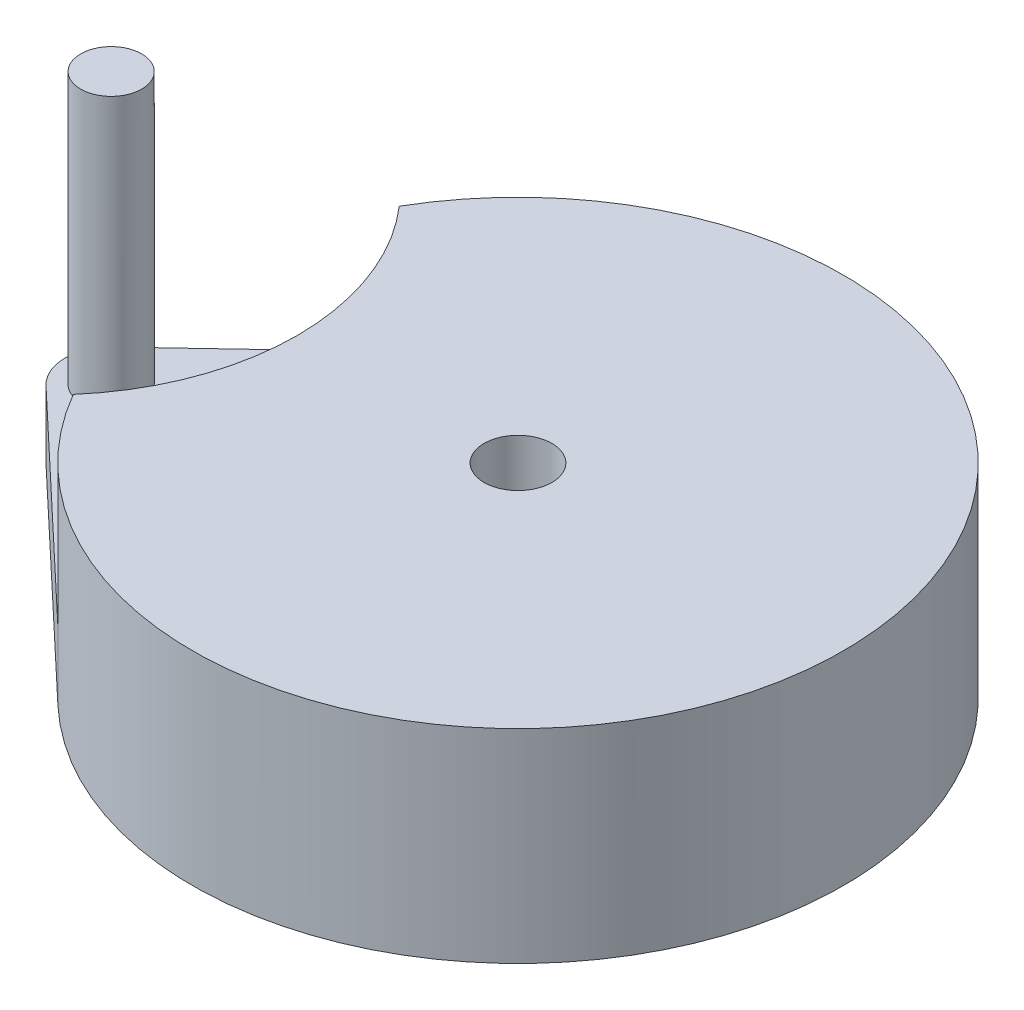
ISO-10303-21;
HEADER;
FILE_DESCRIPTION(('STEP AP214'),'2;1');
FILE_NAME('part.step','',(''),(''),'','','');
FILE_SCHEMA(('AUTOMOTIVE_DESIGN { 1 0 10303 214 1 1 1 1 }'));
ENDSEC;
DATA;
#1=APPLICATION_CONTEXT('core data for automotive mechanical design processes');
#2=APPLICATION_PROTOCOL_DEFINITION('international standard','automotive_design',2000,#1);
#3=PRODUCT_CONTEXT('',#1,'mechanical');
#4=PRODUCT('Part','Part','',(#3));
#5=PRODUCT_RELATED_PRODUCT_CATEGORY('part','',(#4));
#6=PRODUCT_DEFINITION_FORMATION('','',#4);
#7=PRODUCT_DEFINITION_CONTEXT('part definition',#1,'design');
#8=PRODUCT_DEFINITION('design','',#6,#7);
#9=PRODUCT_DEFINITION_SHAPE('','',#8);
#10=(LENGTH_UNIT() NAMED_UNIT(*) SI_UNIT(.MILLI.,.METRE.));
#11=(NAMED_UNIT(*) PLANE_ANGLE_UNIT() SI_UNIT($,.RADIAN.));
#12=(NAMED_UNIT(*) SI_UNIT($,.STERADIAN.) SOLID_ANGLE_UNIT());
#13=UNCERTAINTY_MEASURE_WITH_UNIT(LENGTH_MEASURE(1.E-05),#10,'distance_accuracy_value','');
#14=(GEOMETRIC_REPRESENTATION_CONTEXT(3) GLOBAL_UNCERTAINTY_ASSIGNED_CONTEXT((#13)) GLOBAL_UNIT_ASSIGNED_CONTEXT((#10,
#11,#12)) REPRESENTATION_CONTEXT('',''));
#15=CARTESIAN_POINT('',(0.,0.,0.));
#16=DIRECTION('',(0.,0.,1.));
#17=DIRECTION('',(1.,0.,0.));
#18=AXIS2_PLACEMENT_3D('',#15,#16,#17);
#19=CARTESIAN_POINT('',(-30.,5.,0.));
#20=DIRECTION('',(0.,1.,0.));
#21=DIRECTION('',(0.,0.,1.));
#22=AXIS2_PLACEMENT_3D('',#19,#20,#21);
#23=PLANE('',#22);
#24=CARTESIAN_POINT('',(-30.,5.,0.));
#25=DIRECTION('',(0.,1.,0.));
#26=DIRECTION('',(0.,0.,-1.));
#27=AXIS2_PLACEMENT_3D('',#24,#25,#26);
#28=CIRCLE('',#27,2.25);
#29=CARTESIAN_POINT('',(-30.,5.,-2.25));
#30=VERTEX_POINT('',#29);
#31=EDGE_CURVE('E178',#30,#30,#28,.T.);
#32=ORIENTED_EDGE('',*,*,#31,.F.);
#33=EDGE_LOOP('',(#32));
#34=FACE_BOUND('',#33,.T.);
#35=CARTESIAN_POINT('',(0.,5.,0.));
#36=DIRECTION('',(0.,1.,0.));
#37=DIRECTION('',(0.,0.,1.));
#38=AXIS2_PLACEMENT_3D('',#35,#36,#37);
#39=CIRCLE('',#38,24.0000000000027);
#40=CARTESIAN_POINT('',(-20.7733185171767,5.,12.0195356725646));
#41=VERTEX_POINT('',#40);
#42=CARTESIAN_POINT('',(-16.480000000004,5.,17.4473379058239));
#43=VERTEX_POINT('',#42);
#44=EDGE_CURVE('E50',#41,#43,#39,.T.);
#45=ORIENTED_EDGE('',*,*,#44,.F.);
#46=CARTESIAN_POINT('',(-34.5924578801075,5.,0.));
#47=DIRECTION('',(0.,-1.,0.));
#48=DIRECTION('',(0.,0.,1.));
#49=AXIS2_PLACEMENT_3D('',#46,#47,#48);
#50=CIRCLE('',#49,18.3149624765151);
#51=CARTESIAN_POINT('',(-20.7733185171767,5.,-12.0195356725646));
#52=VERTEX_POINT('',#51);
#53=EDGE_CURVE('E121',#52,#41,#50,.T.);
#54=ORIENTED_EDGE('',*,*,#53,.F.);
#55=CARTESIAN_POINT('',(-16.480000000004,5.,-17.4473379058239));
#56=VERTEX_POINT('',#55);
#57=EDGE_CURVE('E11',#56,#52,#39,.T.);
#58=ORIENTED_EDGE('',*,*,#57,.F.);
#59=DIRECTION('',(-0.726972412742579,0.,0.686666666666756));
#60=VECTOR('',#59,1.);
#61=CARTESIAN_POINT('',(-32.334666666667,5.,-2.47170620332477));
#62=LINE('',#61,#60);
#63=CARTESIAN_POINT('',(-32.334666666667,5.,-2.47170620332477));
#64=VERTEX_POINT('',#63);
#65=EDGE_CURVE('E64',#56,#64,#62,.T.);
#66=ORIENTED_EDGE('',*,*,#65,.T.);
#67=CARTESIAN_POINT('',(-30.,5.,0.));
#68=DIRECTION('',(0.,1.,0.));
#69=DIRECTION('',(0.,0.,1.));
#70=AXIS2_PLACEMENT_3D('',#67,#68,#69);
#71=CIRCLE('',#70,3.4);
#72=CARTESIAN_POINT('',(-32.334666666667,5.,2.47170620332477));
#73=VERTEX_POINT('',#72);
#74=EDGE_CURVE('E132',#64,#73,#71,.T.);
#75=ORIENTED_EDGE('',*,*,#74,.T.);
#76=DIRECTION('',(0.726972412742579,0.,0.686666666666756));
#77=VECTOR('',#76,1.);
#78=CARTESIAN_POINT('',(-32.334666666667,5.,2.47170620332477));
#79=LINE('',#78,#77);
#80=EDGE_CURVE('E92',#73,#43,#79,.T.);
#81=ORIENTED_EDGE('',*,*,#80,.T.);
#82=EDGE_LOOP('',(#45,#54,#58,#66,#75,#81));
#83=FACE_BOUND('',#82,.T.);
#84=ADVANCED_FACE('F39',(#34,#83),#23,.T.);
#85=CARTESIAN_POINT('',(-30.,0.,0.));
#86=DIRECTION('',(0.,1.,0.));
#87=DIRECTION('',(0.,0.,1.));
#88=AXIS2_PLACEMENT_3D('',#85,#86,#87);
#89=PLANE('',#88);
#90=CARTESIAN_POINT('',(-30.,0.,0.));
#91=DIRECTION('',(0.,1.,0.));
#92=DIRECTION('',(0.,0.,1.));
#93=AXIS2_PLACEMENT_3D('',#90,#91,#92);
#94=CIRCLE('',#93,3.4);
#95=CARTESIAN_POINT('',(-32.334666666667,0.,-2.47170620332477));
#96=VERTEX_POINT('',#95);
#97=CARTESIAN_POINT('',(-32.334666666667,0.,2.47170620332477));
#98=VERTEX_POINT('',#97);
#99=EDGE_CURVE('E128',#96,#98,#94,.T.);
#100=ORIENTED_EDGE('',*,*,#99,.F.);
#101=DIRECTION('',(-0.726972412742579,0.,0.686666666666756));
#102=VECTOR('',#101,1.);
#103=CARTESIAN_POINT('',(-32.334666666667,0.,-2.47170620332477));
#104=LINE('',#103,#102);
#105=CARTESIAN_POINT('',(-16.480000000004,0.,-17.4473379058239));
#106=VERTEX_POINT('',#105);
#107=EDGE_CURVE('E85',#106,#96,#104,.T.);
#108=ORIENTED_EDGE('',*,*,#107,.F.);
#109=CARTESIAN_POINT('',(0.,0.,0.));
#110=DIRECTION('',(0.,1.,0.));
#111=DIRECTION('',(0.,0.,1.));
#112=AXIS2_PLACEMENT_3D('',#109,#110,#111);
#113=CIRCLE('',#112,24.0000000000027);
#114=CARTESIAN_POINT('',(-16.480000000004,0.,17.4473379058239));
#115=VERTEX_POINT('',#114);
#116=EDGE_CURVE('E146',#115,#106,#113,.T.);
#117=ORIENTED_EDGE('',*,*,#116,.F.);
#118=DIRECTION('',(0.726972412742579,0.,0.686666666666756));
#119=VECTOR('',#118,1.);
#120=CARTESIAN_POINT('',(-32.334666666667,0.,2.47170620332477));
#121=LINE('',#120,#119);
#122=EDGE_CURVE('E143',#98,#115,#121,.T.);
#123=ORIENTED_EDGE('',*,*,#122,.F.);
#124=EDGE_LOOP('',(#100,#108,#117,#123));
#125=FACE_BOUND('',#124,.T.);
#126=CARTESIAN_POINT('',(0.,0.,0.));
#127=DIRECTION('',(0.,1.,0.));
#128=DIRECTION('',(0.,0.,1.));
#129=AXIS2_PLACEMENT_3D('',#126,#127,#128);
#130=CIRCLE('',#129,2.5);
#131=CARTESIAN_POINT('',(0.,0.,2.5));
#132=VERTEX_POINT('',#131);
#133=EDGE_CURVE('E123',#132,#132,#130,.T.);
#134=ORIENTED_EDGE('',*,*,#133,.T.);
#135=EDGE_LOOP('',(#134));
#136=FACE_BOUND('',#135,.T.);
#137=ADVANCED_FACE('F166',(#125,#136),#89,.F.);
#138=CARTESIAN_POINT('',(-30.,5.,0.));
#139=DIRECTION('',(0.,-1.,0.));
#140=DIRECTION('',(0.,0.,-1.));
#141=AXIS2_PLACEMENT_3D('',#138,#139,#140);
#142=CYLINDRICAL_SURFACE('',#141,3.4);
#143=ORIENTED_EDGE('',*,*,#99,.T.);
#144=DIRECTION('',(0.,-1.,0.));
#145=VECTOR('',#144,1.);
#146=CARTESIAN_POINT('',(-32.334666666667,5.,2.47170620332477));
#147=LINE('',#146,#145);
#148=EDGE_CURVE('E43',#73,#98,#147,.T.);
#149=ORIENTED_EDGE('',*,*,#148,.F.);
#150=ORIENTED_EDGE('',*,*,#74,.F.);
#151=DIRECTION('',(0.,-1.,0.));
#152=VECTOR('',#151,1.);
#153=CARTESIAN_POINT('',(-32.334666666667,5.,-2.47170620332477));
#154=LINE('',#153,#152);
#155=EDGE_CURVE('E139',#64,#96,#154,.T.);
#156=ORIENTED_EDGE('',*,*,#155,.T.);
#157=EDGE_LOOP('',(#143,#149,#150,#156));
#158=FACE_BOUND('',#157,.T.);
#159=ADVANCED_FACE('F41',(#158),#142,.T.);
#160=CARTESIAN_POINT('',(-32.334666666667,5.,2.47170620332477));
#161=DIRECTION('',(0.686666666666756,0.,-0.726972412742579));
#162=DIRECTION('',(-0.726972412742579,0.,-0.686666666666756));
#163=AXIS2_PLACEMENT_3D('',#160,#161,#162);
#164=PLANE('',#163);
#165=ORIENTED_EDGE('',*,*,#122,.T.);
#166=DIRECTION('',(0.,-1.,0.));
#167=VECTOR('',#166,1.);
#168=CARTESIAN_POINT('',(-16.480000000004,5.,17.4473379058239));
#169=LINE('',#168,#167);
#170=EDGE_CURVE('E155',#43,#115,#169,.T.);
#171=ORIENTED_EDGE('',*,*,#170,.F.);
#172=ORIENTED_EDGE('',*,*,#80,.F.);
#173=ORIENTED_EDGE('',*,*,#148,.T.);
#174=EDGE_LOOP('',(#165,#171,#172,#173));
#175=FACE_BOUND('',#174,.T.);
#176=ADVANCED_FACE('F161',(#175),#164,.F.);
#177=CARTESIAN_POINT('',(0.,5.,0.));
#178=DIRECTION('',(0.,-1.,0.));
#179=DIRECTION('',(0.,0.,-1.));
#180=AXIS2_PLACEMENT_3D('',#177,#178,#179);
#181=CYLINDRICAL_SURFACE('',#180,24.0000000000027);
#182=ORIENTED_EDGE('',*,*,#116,.T.);
#183=DIRECTION('',(0.,-1.,0.));
#184=VECTOR('',#183,1.);
#185=CARTESIAN_POINT('',(-16.480000000004,5.,-17.4473379058239));
#186=LINE('',#185,#184);
#187=EDGE_CURVE('E153',#56,#106,#186,.T.);
#188=ORIENTED_EDGE('',*,*,#187,.F.);
#189=ORIENTED_EDGE('',*,*,#57,.T.);
#190=DIRECTION('',(0.,-1.,0.));
#191=VECTOR('',#190,1.);
#192=CARTESIAN_POINT('',(-20.7733185171767,15.,-12.0195356725646));
#193=LINE('',#192,#191);
#194=CARTESIAN_POINT('',(-20.7733185171767,15.,-12.0195356725646));
#195=VERTEX_POINT('',#194);
#196=EDGE_CURVE('E109',#195,#52,#193,.T.);
#197=ORIENTED_EDGE('',*,*,#196,.F.);
#198=CARTESIAN_POINT('',(0.,15.,0.));
#199=DIRECTION('',(0.,1.,0.));
#200=DIRECTION('',(0.,0.,1.));
#201=AXIS2_PLACEMENT_3D('',#198,#199,#200);
#202=CIRCLE('',#201,24.0000000000027);
#203=CARTESIAN_POINT('',(-20.7733185171767,15.,12.0195356725646));
#204=VERTEX_POINT('',#203);
#205=EDGE_CURVE('E102',#204,#195,#202,.T.);
#206=ORIENTED_EDGE('',*,*,#205,.F.);
#207=DIRECTION('',(0.,-1.,0.));
#208=VECTOR('',#207,1.);
#209=CARTESIAN_POINT('',(-20.7733185171767,15.,12.0195356725646));
#210=LINE('',#209,#208);
#211=EDGE_CURVE('E106',#204,#41,#210,.T.);
#212=ORIENTED_EDGE('',*,*,#211,.T.);
#213=ORIENTED_EDGE('',*,*,#44,.T.);
#214=ORIENTED_EDGE('',*,*,#170,.T.);
#215=EDGE_LOOP('',(#182,#188,#189,#197,#206,#212,#213,#214));
#216=FACE_BOUND('',#215,.T.);
#217=ADVANCED_FACE('F104',(#216),#181,.T.);
#218=CARTESIAN_POINT('',(-32.334666666667,5.,-2.47170620332477));
#219=DIRECTION('',(0.686666666666756,0.,0.726972412742579));
#220=DIRECTION('',(0.726972412742579,0.,-0.686666666666756));
#221=AXIS2_PLACEMENT_3D('',#218,#219,#220);
#222=PLANE('',#221);
#223=ORIENTED_EDGE('',*,*,#107,.T.);
#224=ORIENTED_EDGE('',*,*,#155,.F.);
#225=ORIENTED_EDGE('',*,*,#65,.F.);
#226=ORIENTED_EDGE('',*,*,#187,.T.);
#227=EDGE_LOOP('',(#223,#224,#225,#226));
#228=FACE_BOUND('',#227,.T.);
#229=ADVANCED_FACE('F169',(#228),#222,.F.);
#230=CARTESIAN_POINT('',(0.,5.,0.));
#231=DIRECTION('',(0.,-1.,0.));
#232=DIRECTION('',(0.,0.,-1.));
#233=AXIS2_PLACEMENT_3D('',#230,#231,#232);
#234=CYLINDRICAL_SURFACE('',#233,2.5);
#235=ORIENTED_EDGE('',*,*,#133,.F.);
#236=EDGE_LOOP('',(#235));
#237=FACE_BOUND('',#236,.T.);
#238=CARTESIAN_POINT('',(0.,15.,0.));
#239=DIRECTION('',(0.,1.,0.));
#240=DIRECTION('',(0.,0.,1.));
#241=AXIS2_PLACEMENT_3D('',#238,#239,#240);
#242=CIRCLE('',#241,2.5);
#243=CARTESIAN_POINT('',(0.,15.,2.5));
#244=VERTEX_POINT('',#243);
#245=EDGE_CURVE('E172',#244,#244,#242,.T.);
#246=ORIENTED_EDGE('',*,*,#245,.T.);
#247=EDGE_LOOP('',(#246));
#248=FACE_BOUND('',#247,.T.);
#249=ADVANCED_FACE('F209',(#237,#248),#234,.F.);
#250=CARTESIAN_POINT('',(-17.2962289400537,15.,0.));
#251=DIRECTION('',(0.,1.,0.));
#252=DIRECTION('',(0.,0.,1.));
#253=AXIS2_PLACEMENT_3D('',#250,#251,#252);
#254=PLANE('',#253);
#255=CARTESIAN_POINT('',(-34.5924578801075,15.,0.));
#256=DIRECTION('',(0.,-1.,0.));
#257=DIRECTION('',(0.,0.,1.));
#258=AXIS2_PLACEMENT_3D('',#255,#256,#257);
#259=CIRCLE('',#258,18.3149624765151);
#260=EDGE_CURVE('E113',#195,#204,#259,.T.);
#261=ORIENTED_EDGE('',*,*,#260,.T.);
#262=ORIENTED_EDGE('',*,*,#205,.T.);
#263=EDGE_LOOP('',(#261,#262));
#264=FACE_BOUND('',#263,.T.);
#265=ORIENTED_EDGE('',*,*,#245,.F.);
#266=EDGE_LOOP('',(#265));
#267=FACE_BOUND('',#266,.T.);
#268=ADVANCED_FACE('F115',(#264,#267),#254,.T.);
#269=CARTESIAN_POINT('',(-34.5924578801075,15.,0.));
#270=DIRECTION('',(0.,-1.,0.));
#271=DIRECTION('',(0.,0.,-1.));
#272=AXIS2_PLACEMENT_3D('',#269,#270,#271);
#273=CYLINDRICAL_SURFACE('',#272,18.3149624765151);
#274=ORIENTED_EDGE('',*,*,#53,.T.);
#275=ORIENTED_EDGE('',*,*,#211,.F.);
#276=ORIENTED_EDGE('',*,*,#260,.F.);
#277=ORIENTED_EDGE('',*,*,#196,.T.);
#278=EDGE_LOOP('',(#274,#275,#276,#277));
#279=FACE_BOUND('',#278,.T.);
#280=ADVANCED_FACE('F120',(#279),#273,.F.);
#281=CARTESIAN_POINT('',(-30.,15.,0.));
#282=DIRECTION('',(0.,-1.,0.));
#283=DIRECTION('',(0.,0.,-1.));
#284=AXIS2_PLACEMENT_3D('',#281,#282,#283);
#285=CYLINDRICAL_SURFACE('',#284,2.25);
#286=ORIENTED_EDGE('',*,*,#31,.T.);
#287=EDGE_LOOP('',(#286));
#288=FACE_BOUND('',#287,.T.);
#289=CARTESIAN_POINT('',(-30.,25.,0.));
#290=DIRECTION('',(0.,1.,0.));
#291=DIRECTION('',(0.,0.,1.));
#292=AXIS2_PLACEMENT_3D('',#289,#290,#291);
#293=CIRCLE('',#292,2.25);
#294=CARTESIAN_POINT('',(-30.,25.,2.25));
#295=VERTEX_POINT('',#294);
#296=EDGE_CURVE('E182',#295,#295,#293,.T.);
#297=ORIENTED_EDGE('',*,*,#296,.F.);
#298=EDGE_LOOP('',(#297));
#299=FACE_BOUND('',#298,.T.);
#300=ADVANCED_FACE('F189',(#288,#299),#285,.T.);
#301=CARTESIAN_POINT('',(-30.,25.,0.));
#302=DIRECTION('',(0.,1.,0.));
#303=DIRECTION('',(0.,0.,1.));
#304=AXIS2_PLACEMENT_3D('',#301,#302,#303);
#305=PLANE('',#304);
#306=ORIENTED_EDGE('',*,*,#296,.T.);
#307=EDGE_LOOP('',(#306));
#308=FACE_BOUND('',#307,.T.);
#309=ADVANCED_FACE('F187',(#308),#305,.T.);
#310=CLOSED_SHELL('',(#84,#137,#159,#176,#217,#229,#249,#268,#280,#300,#309));
#311=MANIFOLD_SOLID_BREP('B2',#310);
#312=ADVANCED_BREP_SHAPE_REPRESENTATION('',(#18,#311),#14);
#313=SHAPE_DEFINITION_REPRESENTATION(#9,#312);
ENDSEC;
END-ISO-10303-21;
